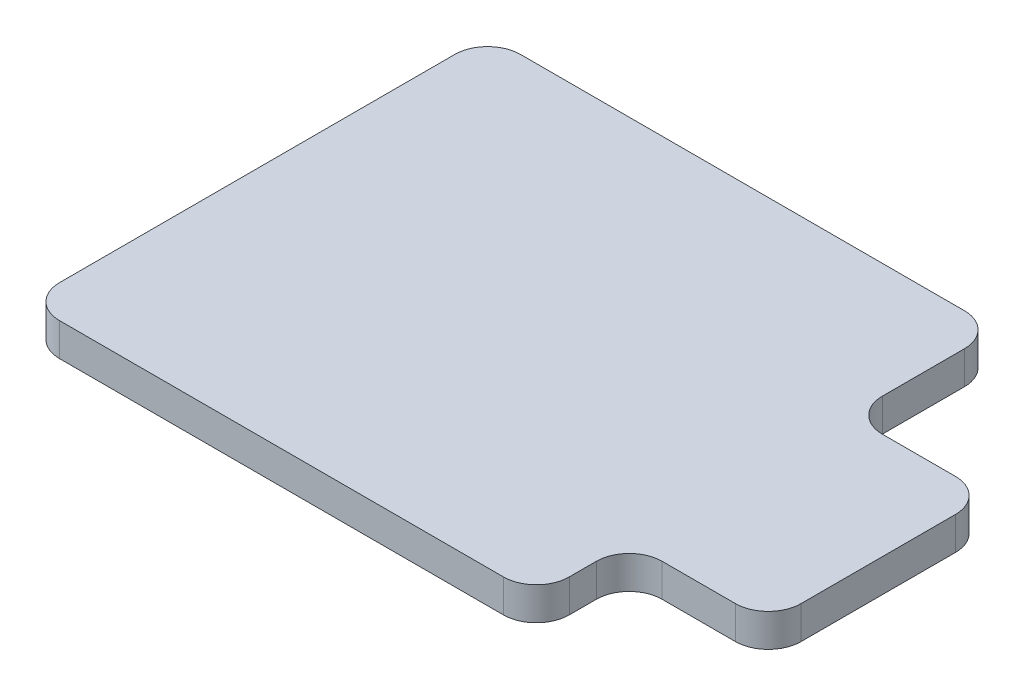
ISO-10303-21;
HEADER;
FILE_DESCRIPTION(('STEP AP214'),'2;1');
FILE_NAME('part.step','',(''),(''),'','','');
FILE_SCHEMA(('AUTOMOTIVE_DESIGN { 1 0 10303 214 1 1 1 1 }'));
ENDSEC;
DATA;
#1=APPLICATION_CONTEXT('core data for automotive mechanical design processes');
#2=APPLICATION_PROTOCOL_DEFINITION('international standard','automotive_design',2000,#1);
#3=PRODUCT_CONTEXT('',#1,'mechanical');
#4=PRODUCT('Part','Part','',(#3));
#5=PRODUCT_RELATED_PRODUCT_CATEGORY('part','',(#4));
#6=PRODUCT_DEFINITION_FORMATION('','',#4);
#7=PRODUCT_DEFINITION_CONTEXT('part definition',#1,'design');
#8=PRODUCT_DEFINITION('design','',#6,#7);
#9=PRODUCT_DEFINITION_SHAPE('','',#8);
#10=(LENGTH_UNIT() NAMED_UNIT(*) SI_UNIT(.MILLI.,.METRE.));
#11=(NAMED_UNIT(*) PLANE_ANGLE_UNIT() SI_UNIT($,.RADIAN.));
#12=(NAMED_UNIT(*) SI_UNIT($,.STERADIAN.) SOLID_ANGLE_UNIT());
#13=UNCERTAINTY_MEASURE_WITH_UNIT(LENGTH_MEASURE(1.E-05),#10,'distance_accuracy_value','');
#14=(GEOMETRIC_REPRESENTATION_CONTEXT(3) GLOBAL_UNCERTAINTY_ASSIGNED_CONTEXT((#13)) GLOBAL_UNIT_ASSIGNED_CONTEXT((#10,
#11,#12)) REPRESENTATION_CONTEXT('',''));
#15=CARTESIAN_POINT('',(0.,0.,0.));
#16=DIRECTION('',(0.,0.,1.));
#17=DIRECTION('',(1.,0.,0.));
#18=AXIS2_PLACEMENT_3D('',#15,#16,#17);
#19=CARTESIAN_POINT('',(0.,2.54,-6.36701226966257));
#20=DIRECTION('',(0.,0.,-1.));
#21=DIRECTION('',(-1.,0.,0.));
#22=AXIS2_PLACEMENT_3D('',#19,#20,#21);
#23=PLANE('',#22);
#24=DIRECTION('',(1.,0.,0.));
#25=VECTOR('',#24,1.);
#26=CARTESIAN_POINT('',(0.,0.,-6.36701226966257));
#27=LINE('',#26,#25);
#28=CARTESIAN_POINT('',(22.1981811644824,0.,-6.36701226966257));
#29=VERTEX_POINT('',#28);
#30=CARTESIAN_POINT('',(27.8398188355176,0.,-6.36701226966257));
#31=VERTEX_POINT('',#30);
#32=EDGE_CURVE('E183',#29,#31,#27,.T.);
#33=ORIENTED_EDGE('',*,*,#32,.F.);
#34=DIRECTION('',(0.,-1.,0.));
#35=VECTOR('',#34,1.);
#36=CARTESIAN_POINT('',(22.1981811644824,2.54,-6.36701226966257));
#37=LINE('',#36,#35);
#38=CARTESIAN_POINT('',(22.1981811644824,2.54,-6.36701226966257));
#39=VERTEX_POINT('',#38);
#40=EDGE_CURVE('E11',#39,#29,#37,.T.);
#41=ORIENTED_EDGE('',*,*,#40,.F.);
#42=DIRECTION('',(1.,0.,0.));
#43=VECTOR('',#42,1.);
#44=CARTESIAN_POINT('',(0.,2.54,-6.36701226966257));
#45=LINE('',#44,#43);
#46=CARTESIAN_POINT('',(27.8398188355176,2.54,-6.36701226966257));
#47=VERTEX_POINT('',#46);
#48=EDGE_CURVE('E221',#39,#47,#45,.T.);
#49=ORIENTED_EDGE('',*,*,#48,.T.);
#50=DIRECTION('',(0.,-1.,0.));
#51=VECTOR('',#50,1.);
#52=CARTESIAN_POINT('',(27.8398188355176,2.54,-6.36701226966257));
#53=LINE('',#52,#51);
#54=EDGE_CURVE('E57',#47,#31,#53,.T.);
#55=ORIENTED_EDGE('',*,*,#54,.T.);
#56=EDGE_LOOP('',(#33,#41,#49,#55));
#57=FACE_BOUND('',#56,.T.);
#58=ADVANCED_FACE('F41',(#57),#23,.T.);
#59=CARTESIAN_POINT('',(22.1981811644824,2.54,-8.90701226966257));
#60=DIRECTION('',(0.,-1.,0.));
#61=DIRECTION('',(0.,0.,-1.));
#62=AXIS2_PLACEMENT_3D('',#59,#60,#61);
#63=CYLINDRICAL_SURFACE('',#62,2.54);
#64=CARTESIAN_POINT('',(22.1981811644824,0.,-8.90701226966257));
#65=DIRECTION('',(0.,1.,0.));
#66=DIRECTION('',(0.,0.,1.));
#67=AXIS2_PLACEMENT_3D('',#64,#65,#66);
#68=CIRCLE('',#67,2.54);
#69=CARTESIAN_POINT('',(19.6581811644824,0.,-8.90701226966257));
#70=VERTEX_POINT('',#69);
#71=EDGE_CURVE('E185',#29,#70,#68,.F.);
#72=ORIENTED_EDGE('',*,*,#71,.T.);
#73=DIRECTION('',(0.,-1.,0.));
#74=VECTOR('',#73,1.);
#75=CARTESIAN_POINT('',(19.6581811644824,2.54,-8.90701226966257));
#76=LINE('',#75,#74);
#77=CARTESIAN_POINT('',(19.6581811644824,2.54,-8.90701226966257));
#78=VERTEX_POINT('',#77);
#79=EDGE_CURVE('E49',#78,#70,#76,.T.);
#80=ORIENTED_EDGE('',*,*,#79,.F.);
#81=CARTESIAN_POINT('',(22.1981811644824,2.54,-8.90701226966257));
#82=DIRECTION('',(0.,1.,0.));
#83=DIRECTION('',(0.,0.,1.));
#84=AXIS2_PLACEMENT_3D('',#81,#82,#83);
#85=CIRCLE('',#84,2.54);
#86=EDGE_CURVE('E273',#39,#78,#85,.F.);
#87=ORIENTED_EDGE('',*,*,#86,.F.);
#88=ORIENTED_EDGE('',*,*,#40,.T.);
#89=EDGE_LOOP('',(#72,#80,#87,#88));
#90=FACE_BOUND('',#89,.T.);
#91=ADVANCED_FACE('F313',(#90),#63,.F.);
#92=CARTESIAN_POINT('',(19.6581811644824,2.54,0.));
#93=DIRECTION('',(-1.,0.,0.));
#94=DIRECTION('',(0.,0.,1.));
#95=AXIS2_PLACEMENT_3D('',#92,#93,#94);
#96=PLANE('',#95);
#97=DIRECTION('',(0.,0.,-1.));
#98=VECTOR('',#97,1.);
#99=CARTESIAN_POINT('',(19.6581811644824,0.,0.));
#100=LINE('',#99,#98);
#101=CARTESIAN_POINT('',(19.6581811644824,0.,-15.24));
#102=VERTEX_POINT('',#101);
#103=EDGE_CURVE('E187',#70,#102,#100,.T.);
#104=ORIENTED_EDGE('',*,*,#103,.T.);
#105=DIRECTION('',(0.,-1.,0.));
#106=VECTOR('',#105,1.);
#107=CARTESIAN_POINT('',(19.6581811644824,2.54,-15.24));
#108=LINE('',#107,#106);
#109=CARTESIAN_POINT('',(19.6581811644824,2.54,-15.24));
#110=VERTEX_POINT('',#109);
#111=EDGE_CURVE('E247',#110,#102,#108,.T.);
#112=ORIENTED_EDGE('',*,*,#111,.F.);
#113=DIRECTION('',(0.,0.,-1.));
#114=VECTOR('',#113,1.);
#115=CARTESIAN_POINT('',(19.6581811644824,2.54,0.));
#116=LINE('',#115,#114);
#117=EDGE_CURVE('E255',#78,#110,#116,.T.);
#118=ORIENTED_EDGE('',*,*,#117,.F.);
#119=ORIENTED_EDGE('',*,*,#79,.T.);
#120=EDGE_LOOP('',(#104,#112,#118,#119));
#121=FACE_BOUND('',#120,.T.);
#122=ADVANCED_FACE('F253',(#121),#96,.F.);
#123=CARTESIAN_POINT('',(17.1181811644824,2.54,-15.24));
#124=DIRECTION('',(0.,-1.,0.));
#125=DIRECTION('',(0.,0.,-1.));
#126=AXIS2_PLACEMENT_3D('',#123,#124,#125);
#127=CYLINDRICAL_SURFACE('',#126,2.54);
#128=CARTESIAN_POINT('',(17.1181811644824,0.,-15.24));
#129=DIRECTION('',(0.,1.,0.));
#130=DIRECTION('',(0.,0.,1.));
#131=AXIS2_PLACEMENT_3D('',#128,#129,#130);
#132=CIRCLE('',#131,2.54);
#133=CARTESIAN_POINT('',(17.1181811644824,0.,-17.78));
#134=VERTEX_POINT('',#133);
#135=EDGE_CURVE('E190',#134,#102,#132,.F.);
#136=ORIENTED_EDGE('',*,*,#135,.F.);
#137=DIRECTION('',(0.,-1.,0.));
#138=VECTOR('',#137,1.);
#139=CARTESIAN_POINT('',(17.1181811644824,2.54,-17.78));
#140=LINE('',#139,#138);
#141=CARTESIAN_POINT('',(17.1181811644824,2.54,-17.78));
#142=VERTEX_POINT('',#141);
#143=EDGE_CURVE('E245',#142,#134,#140,.T.);
#144=ORIENTED_EDGE('',*,*,#143,.F.);
#145=CARTESIAN_POINT('',(17.1181811644824,2.54,-15.24));
#146=DIRECTION('',(0.,1.,0.));
#147=DIRECTION('',(0.,0.,1.));
#148=AXIS2_PLACEMENT_3D('',#145,#146,#147);
#149=CIRCLE('',#148,2.54);
#150=EDGE_CURVE('E266',#142,#110,#149,.F.);
#151=ORIENTED_EDGE('',*,*,#150,.T.);
#152=ORIENTED_EDGE('',*,*,#111,.T.);
#153=EDGE_LOOP('',(#136,#144,#151,#152));
#154=FACE_BOUND('',#153,.T.);
#155=ADVANCED_FACE('F263',(#154),#127,.T.);
#156=CARTESIAN_POINT('',(0.,2.54,-17.78));
#157=DIRECTION('',(0.,0.,-1.));
#158=DIRECTION('',(-1.,0.,0.));
#159=AXIS2_PLACEMENT_3D('',#156,#157,#158);
#160=PLANE('',#159);
#161=DIRECTION('',(1.,0.,0.));
#162=VECTOR('',#161,1.);
#163=CARTESIAN_POINT('',(0.,0.,-17.78));
#164=LINE('',#163,#162);
#165=CARTESIAN_POINT('',(-17.1181811644824,0.,-17.78));
#166=VERTEX_POINT('',#165);
#167=EDGE_CURVE('E193',#166,#134,#164,.T.);
#168=ORIENTED_EDGE('',*,*,#167,.F.);
#169=DIRECTION('',(0.,-1.,0.));
#170=VECTOR('',#169,1.);
#171=CARTESIAN_POINT('',(-17.1181811644824,2.54,-17.78));
#172=LINE('',#171,#170);
#173=CARTESIAN_POINT('',(-17.1181811644824,2.54,-17.78));
#174=VERTEX_POINT('',#173);
#175=EDGE_CURVE('E243',#174,#166,#172,.T.);
#176=ORIENTED_EDGE('',*,*,#175,.F.);
#177=DIRECTION('',(1.,0.,0.));
#178=VECTOR('',#177,1.);
#179=CARTESIAN_POINT('',(0.,2.54,-17.78));
#180=LINE('',#179,#178);
#181=EDGE_CURVE('E269',#174,#142,#180,.T.);
#182=ORIENTED_EDGE('',*,*,#181,.T.);
#183=ORIENTED_EDGE('',*,*,#143,.T.);
#184=EDGE_LOOP('',(#168,#176,#182,#183));
#185=FACE_BOUND('',#184,.T.);
#186=ADVANCED_FACE('F324',(#185),#160,.T.);
#187=CARTESIAN_POINT('',(-17.1181811644824,2.54,-15.24));
#188=DIRECTION('',(0.,-1.,0.));
#189=DIRECTION('',(0.,0.,-1.));
#190=AXIS2_PLACEMENT_3D('',#187,#188,#189);
#191=CYLINDRICAL_SURFACE('',#190,2.54);
#192=CARTESIAN_POINT('',(-17.1181811644824,0.,-15.24));
#193=DIRECTION('',(0.,1.,0.));
#194=DIRECTION('',(0.,0.,1.));
#195=AXIS2_PLACEMENT_3D('',#192,#193,#194);
#196=CIRCLE('',#195,2.54);
#197=CARTESIAN_POINT('',(-19.6581811644824,0.,-15.24));
#198=VERTEX_POINT('',#197);
#199=EDGE_CURVE('E196',#198,#166,#196,.F.);
#200=ORIENTED_EDGE('',*,*,#199,.F.);
#201=DIRECTION('',(0.,-1.,0.));
#202=VECTOR('',#201,1.);
#203=CARTESIAN_POINT('',(-19.6581811644824,2.54,-15.24));
#204=LINE('',#203,#202);
#205=CARTESIAN_POINT('',(-19.6581811644824,2.54,-15.24));
#206=VERTEX_POINT('',#205);
#207=EDGE_CURVE('E241',#206,#198,#204,.T.);
#208=ORIENTED_EDGE('',*,*,#207,.F.);
#209=CARTESIAN_POINT('',(-17.1181811644824,2.54,-15.24));
#210=DIRECTION('',(0.,1.,0.));
#211=DIRECTION('',(0.,0.,1.));
#212=AXIS2_PLACEMENT_3D('',#209,#210,#211);
#213=CIRCLE('',#212,2.54);
#214=EDGE_CURVE('E271',#206,#174,#213,.F.);
#215=ORIENTED_EDGE('',*,*,#214,.T.);
#216=ORIENTED_EDGE('',*,*,#175,.T.);
#217=EDGE_LOOP('',(#200,#208,#215,#216));
#218=FACE_BOUND('',#217,.T.);
#219=ADVANCED_FACE('F327',(#218),#191,.T.);
#220=CARTESIAN_POINT('',(-19.6581811644824,2.54,0.));
#221=DIRECTION('',(-1.,0.,0.));
#222=DIRECTION('',(0.,0.,1.));
#223=AXIS2_PLACEMENT_3D('',#220,#221,#222);
#224=PLANE('',#223);
#225=DIRECTION('',(0.,0.,-1.));
#226=VECTOR('',#225,1.);
#227=CARTESIAN_POINT('',(-19.6581811644824,0.,0.));
#228=LINE('',#227,#226);
#229=CARTESIAN_POINT('',(-19.6581811644824,0.,15.24));
#230=VERTEX_POINT('',#229);
#231=EDGE_CURVE('E199',#230,#198,#228,.T.);
#232=ORIENTED_EDGE('',*,*,#231,.F.);
#233=DIRECTION('',(0.,-1.,0.));
#234=VECTOR('',#233,1.);
#235=CARTESIAN_POINT('',(-19.6581811644824,2.54,15.24));
#236=LINE('',#235,#234);
#237=CARTESIAN_POINT('',(-19.6581811644824,2.54,15.24));
#238=VERTEX_POINT('',#237);
#239=EDGE_CURVE('E239',#238,#230,#236,.T.);
#240=ORIENTED_EDGE('',*,*,#239,.F.);
#241=DIRECTION('',(0.,0.,-1.));
#242=VECTOR('',#241,1.);
#243=CARTESIAN_POINT('',(-19.6581811644824,2.54,0.));
#244=LINE('',#243,#242);
#245=EDGE_CURVE('E279',#238,#206,#244,.T.);
#246=ORIENTED_EDGE('',*,*,#245,.T.);
#247=ORIENTED_EDGE('',*,*,#207,.T.);
#248=EDGE_LOOP('',(#232,#240,#246,#247));
#249=FACE_BOUND('',#248,.T.);
#250=ADVANCED_FACE('F331',(#249),#224,.T.);
#251=CARTESIAN_POINT('',(-17.1181811644824,2.54,15.24));
#252=DIRECTION('',(0.,-1.,0.));
#253=DIRECTION('',(0.,0.,-1.));
#254=AXIS2_PLACEMENT_3D('',#251,#252,#253);
#255=CYLINDRICAL_SURFACE('',#254,2.54);
#256=CARTESIAN_POINT('',(-17.1181811644824,0.,15.24));
#257=DIRECTION('',(0.,1.,0.));
#258=DIRECTION('',(0.,0.,1.));
#259=AXIS2_PLACEMENT_3D('',#256,#257,#258);
#260=CIRCLE('',#259,2.54);
#261=CARTESIAN_POINT('',(-17.1181811644824,0.,17.78));
#262=VERTEX_POINT('',#261);
#263=EDGE_CURVE('E202',#262,#230,#260,.F.);
#264=ORIENTED_EDGE('',*,*,#263,.F.);
#265=DIRECTION('',(0.,-1.,0.));
#266=VECTOR('',#265,1.);
#267=CARTESIAN_POINT('',(-17.1181811644824,2.54,17.78));
#268=LINE('',#267,#266);
#269=CARTESIAN_POINT('',(-17.1181811644824,2.54,17.78));
#270=VERTEX_POINT('',#269);
#271=EDGE_CURVE('E237',#270,#262,#268,.T.);
#272=ORIENTED_EDGE('',*,*,#271,.F.);
#273=CARTESIAN_POINT('',(-17.1181811644824,2.54,15.24));
#274=DIRECTION('',(0.,1.,0.));
#275=DIRECTION('',(0.,0.,1.));
#276=AXIS2_PLACEMENT_3D('',#273,#274,#275);
#277=CIRCLE('',#276,2.54);
#278=EDGE_CURVE('E282',#270,#238,#277,.F.);
#279=ORIENTED_EDGE('',*,*,#278,.T.);
#280=ORIENTED_EDGE('',*,*,#239,.T.);
#281=EDGE_LOOP('',(#264,#272,#279,#280));
#282=FACE_BOUND('',#281,.T.);
#283=ADVANCED_FACE('F335',(#282),#255,.T.);
#284=CARTESIAN_POINT('',(0.,2.54,17.78));
#285=DIRECTION('',(0.,0.,-1.));
#286=DIRECTION('',(-1.,0.,0.));
#287=AXIS2_PLACEMENT_3D('',#284,#285,#286);
#288=PLANE('',#287);
#289=DIRECTION('',(1.,0.,0.));
#290=VECTOR('',#289,1.);
#291=CARTESIAN_POINT('',(0.,0.,17.78));
#292=LINE('',#291,#290);
#293=CARTESIAN_POINT('',(17.1181811644824,0.,17.78));
#294=VERTEX_POINT('',#293);
#295=EDGE_CURVE('E205',#262,#294,#292,.T.);
#296=ORIENTED_EDGE('',*,*,#295,.T.);
#297=DIRECTION('',(0.,-1.,0.));
#298=VECTOR('',#297,1.);
#299=CARTESIAN_POINT('',(17.1181811644824,2.54,17.78));
#300=LINE('',#299,#298);
#301=CARTESIAN_POINT('',(17.1181811644824,2.54,17.78));
#302=VERTEX_POINT('',#301);
#303=EDGE_CURVE('E234',#302,#294,#300,.T.);
#304=ORIENTED_EDGE('',*,*,#303,.F.);
#305=DIRECTION('',(1.,0.,0.));
#306=VECTOR('',#305,1.);
#307=CARTESIAN_POINT('',(0.,2.54,17.78));
#308=LINE('',#307,#306);
#309=EDGE_CURVE('E285',#270,#302,#308,.T.);
#310=ORIENTED_EDGE('',*,*,#309,.F.);
#311=ORIENTED_EDGE('',*,*,#271,.T.);
#312=EDGE_LOOP('',(#296,#304,#310,#311));
#313=FACE_BOUND('',#312,.T.);
#314=ADVANCED_FACE('F339',(#313),#288,.F.);
#315=CARTESIAN_POINT('',(17.1181811644824,2.54,15.24));
#316=DIRECTION('',(0.,-1.,0.));
#317=DIRECTION('',(0.,0.,-1.));
#318=AXIS2_PLACEMENT_3D('',#315,#316,#317);
#319=CYLINDRICAL_SURFACE('',#318,2.54);
#320=CARTESIAN_POINT('',(17.1181811644824,0.,15.24));
#321=DIRECTION('',(0.,1.,0.));
#322=DIRECTION('',(0.,0.,1.));
#323=AXIS2_PLACEMENT_3D('',#320,#321,#322);
#324=CIRCLE('',#323,2.54);
#325=CARTESIAN_POINT('',(19.6581811644824,0.,15.24));
#326=VERTEX_POINT('',#325);
#327=EDGE_CURVE('E207',#294,#326,#324,.T.);
#328=ORIENTED_EDGE('',*,*,#327,.T.);
#329=DIRECTION('',(0.,-1.,0.));
#330=VECTOR('',#329,1.);
#331=CARTESIAN_POINT('',(19.6581811644824,2.54,15.24));
#332=LINE('',#331,#330);
#333=CARTESIAN_POINT('',(19.6581811644824,2.54,15.24));
#334=VERTEX_POINT('',#333);
#335=EDGE_CURVE('E231',#334,#326,#332,.T.);
#336=ORIENTED_EDGE('',*,*,#335,.F.);
#337=CARTESIAN_POINT('',(17.1181811644824,2.54,15.24));
#338=DIRECTION('',(0.,1.,0.));
#339=DIRECTION('',(0.,0.,1.));
#340=AXIS2_PLACEMENT_3D('',#337,#338,#339);
#341=CIRCLE('',#340,2.54);
#342=EDGE_CURVE('E287',#302,#334,#341,.T.);
#343=ORIENTED_EDGE('',*,*,#342,.F.);
#344=ORIENTED_EDGE('',*,*,#303,.T.);
#345=EDGE_LOOP('',(#328,#336,#343,#344));
#346=FACE_BOUND('',#345,.T.);
#347=ADVANCED_FACE('F343',(#346),#319,.T.);
#348=CARTESIAN_POINT('',(19.6581811644824,2.54,0.));
#349=DIRECTION('',(-1.,0.,0.));
#350=DIRECTION('',(0.,0.,1.));
#351=AXIS2_PLACEMENT_3D('',#348,#349,#350);
#352=PLANE('',#351);
#353=DIRECTION('',(0.,0.,-1.));
#354=VECTOR('',#353,1.);
#355=CARTESIAN_POINT('',(19.6581811644824,0.,0.));
#356=LINE('',#355,#354);
#357=CARTESIAN_POINT('',(19.6581811644824,0.,13.1558918479444));
#358=VERTEX_POINT('',#357);
#359=EDGE_CURVE('E209',#326,#358,#356,.T.);
#360=ORIENTED_EDGE('',*,*,#359,.T.);
#361=DIRECTION('',(0.,-1.,0.));
#362=VECTOR('',#361,1.);
#363=CARTESIAN_POINT('',(19.6581811644824,2.54,13.1558918479444));
#364=LINE('',#363,#362);
#365=CARTESIAN_POINT('',(19.6581811644824,2.54,13.1558918479444));
#366=VERTEX_POINT('',#365);
#367=EDGE_CURVE('E228',#366,#358,#364,.T.);
#368=ORIENTED_EDGE('',*,*,#367,.F.);
#369=DIRECTION('',(0.,0.,-1.));
#370=VECTOR('',#369,1.);
#371=CARTESIAN_POINT('',(19.6581811644824,2.54,0.));
#372=LINE('',#371,#370);
#373=EDGE_CURVE('E289',#334,#366,#372,.T.);
#374=ORIENTED_EDGE('',*,*,#373,.F.);
#375=ORIENTED_EDGE('',*,*,#335,.T.);
#376=EDGE_LOOP('',(#360,#368,#374,#375));
#377=FACE_BOUND('',#376,.T.);
#378=ADVANCED_FACE('F347',(#377),#352,.F.);
#379=CARTESIAN_POINT('',(22.1981811644824,2.54,13.1558918479444));
#380=DIRECTION('',(0.,-1.,0.));
#381=DIRECTION('',(0.,0.,-1.));
#382=AXIS2_PLACEMENT_3D('',#379,#380,#381);
#383=CYLINDRICAL_SURFACE('',#382,2.54);
#384=CARTESIAN_POINT('',(22.1981811644824,0.,13.1558918479444));
#385=DIRECTION('',(0.,1.,0.));
#386=DIRECTION('',(0.,0.,1.));
#387=AXIS2_PLACEMENT_3D('',#384,#385,#386);
#388=CIRCLE('',#387,2.54);
#389=CARTESIAN_POINT('',(22.1981811644824,0.,10.6158918479444));
#390=VERTEX_POINT('',#389);
#391=EDGE_CURVE('E211',#358,#390,#388,.F.);
#392=ORIENTED_EDGE('',*,*,#391,.T.);
#393=DIRECTION('',(0.,-1.,0.));
#394=VECTOR('',#393,1.);
#395=CARTESIAN_POINT('',(22.1981811644824,2.54,10.6158918479444));
#396=LINE('',#395,#394);
#397=CARTESIAN_POINT('',(22.1981811644824,2.54,10.6158918479444));
#398=VERTEX_POINT('',#397);
#399=EDGE_CURVE('E225',#398,#390,#396,.T.);
#400=ORIENTED_EDGE('',*,*,#399,.F.);
#401=CARTESIAN_POINT('',(22.1981811644824,2.54,13.1558918479444));
#402=DIRECTION('',(0.,1.,0.));
#403=DIRECTION('',(0.,0.,1.));
#404=AXIS2_PLACEMENT_3D('',#401,#402,#403);
#405=CIRCLE('',#404,2.54);
#406=EDGE_CURVE('E291',#366,#398,#405,.F.);
#407=ORIENTED_EDGE('',*,*,#406,.F.);
#408=ORIENTED_EDGE('',*,*,#367,.T.);
#409=EDGE_LOOP('',(#392,#400,#407,#408));
#410=FACE_BOUND('',#409,.T.);
#411=ADVANCED_FACE('F297',(#410),#383,.F.);
#412=CARTESIAN_POINT('',(0.,2.54,10.6158918479444));
#413=DIRECTION('',(0.,0.,-1.));
#414=DIRECTION('',(-1.,0.,0.));
#415=AXIS2_PLACEMENT_3D('',#412,#413,#414);
#416=PLANE('',#415);
#417=DIRECTION('',(1.,0.,0.));
#418=VECTOR('',#417,1.);
#419=CARTESIAN_POINT('',(0.,0.,10.6158918479444));
#420=LINE('',#419,#418);
#421=CARTESIAN_POINT('',(27.8398188355176,0.,10.6158918479444));
#422=VERTEX_POINT('',#421);
#423=EDGE_CURVE('E213',#390,#422,#420,.T.);
#424=ORIENTED_EDGE('',*,*,#423,.T.);
#425=DIRECTION('',(0.,-1.,0.));
#426=VECTOR('',#425,1.);
#427=CARTESIAN_POINT('',(27.8398188355176,2.54,10.6158918479444));
#428=LINE('',#427,#426);
#429=CARTESIAN_POINT('',(27.8398188355176,2.54,10.6158918479444));
#430=VERTEX_POINT('',#429);
#431=EDGE_CURVE('E175',#430,#422,#428,.T.);
#432=ORIENTED_EDGE('',*,*,#431,.F.);
#433=DIRECTION('',(1.,0.,0.));
#434=VECTOR('',#433,1.);
#435=CARTESIAN_POINT('',(0.,2.54,10.6158918479444));
#436=LINE('',#435,#434);
#437=EDGE_CURVE('E163',#398,#430,#436,.T.);
#438=ORIENTED_EDGE('',*,*,#437,.F.);
#439=ORIENTED_EDGE('',*,*,#399,.T.);
#440=EDGE_LOOP('',(#424,#432,#438,#439));
#441=FACE_BOUND('',#440,.T.);
#442=ADVANCED_FACE('F301',(#441),#416,.F.);
#443=CARTESIAN_POINT('',(27.8398188355176,2.54,8.07589184794443));
#444=DIRECTION('',(0.,-1.,0.));
#445=DIRECTION('',(0.,0.,-1.));
#446=AXIS2_PLACEMENT_3D('',#443,#444,#445);
#447=CYLINDRICAL_SURFACE('',#446,2.54);
#448=CARTESIAN_POINT('',(27.8398188355176,0.,8.07589184794443));
#449=DIRECTION('',(0.,1.,0.));
#450=DIRECTION('',(0.,0.,1.));
#451=AXIS2_PLACEMENT_3D('',#448,#449,#450);
#452=CIRCLE('',#451,2.54);
#453=CARTESIAN_POINT('',(30.3798188355176,0.,8.07589184794443));
#454=VERTEX_POINT('',#453);
#455=EDGE_CURVE('E172',#422,#454,#452,.T.);
#456=ORIENTED_EDGE('',*,*,#455,.T.);
#457=DIRECTION('',(0.,-1.,0.));
#458=VECTOR('',#457,1.);
#459=CARTESIAN_POINT('',(30.3798188355176,2.54,8.07589184794443));
#460=LINE('',#459,#458);
#461=CARTESIAN_POINT('',(30.3798188355176,2.54,8.07589184794443));
#462=VERTEX_POINT('',#461);
#463=EDGE_CURVE('E169',#462,#454,#460,.T.);
#464=ORIENTED_EDGE('',*,*,#463,.F.);
#465=CARTESIAN_POINT('',(27.8398188355176,2.54,8.07589184794443));
#466=DIRECTION('',(0.,1.,0.));
#467=DIRECTION('',(0.,0.,1.));
#468=AXIS2_PLACEMENT_3D('',#465,#466,#467);
#469=CIRCLE('',#468,2.54);
#470=EDGE_CURVE('E155',#430,#462,#469,.T.);
#471=ORIENTED_EDGE('',*,*,#470,.F.);
#472=ORIENTED_EDGE('',*,*,#431,.T.);
#473=EDGE_LOOP('',(#456,#464,#471,#472));
#474=FACE_BOUND('',#473,.T.);
#475=ADVANCED_FACE('F170',(#474),#447,.T.);
#476=CARTESIAN_POINT('',(30.3798188355176,2.54,0.));
#477=DIRECTION('',(1.,0.,0.));
#478=DIRECTION('',(0.,0.,-1.));
#479=AXIS2_PLACEMENT_3D('',#476,#477,#478);
#480=PLANE('',#479);
#481=DIRECTION('',(0.,0.,1.));
#482=VECTOR('',#481,1.);
#483=CARTESIAN_POINT('',(30.3798188355176,0.,0.));
#484=LINE('',#483,#482);
#485=CARTESIAN_POINT('',(30.3798188355176,0.,-3.82701226966257));
#486=VERTEX_POINT('',#485);
#487=EDGE_CURVE('E216',#486,#454,#484,.T.);
#488=ORIENTED_EDGE('',*,*,#487,.F.);
#489=DIRECTION('',(0.,-1.,0.));
#490=VECTOR('',#489,1.);
#491=CARTESIAN_POINT('',(30.3798188355176,2.54,-3.82701226966257));
#492=LINE('',#491,#490);
#493=CARTESIAN_POINT('',(30.3798188355176,2.54,-3.82701226966257));
#494=VERTEX_POINT('',#493);
#495=EDGE_CURVE('E106',#494,#486,#492,.T.);
#496=ORIENTED_EDGE('',*,*,#495,.F.);
#497=DIRECTION('',(0.,0.,1.));
#498=VECTOR('',#497,1.);
#499=CARTESIAN_POINT('',(30.3798188355176,2.54,0.));
#500=LINE('',#499,#498);
#501=EDGE_CURVE('E161',#494,#462,#500,.T.);
#502=ORIENTED_EDGE('',*,*,#501,.T.);
#503=ORIENTED_EDGE('',*,*,#463,.T.);
#504=EDGE_LOOP('',(#488,#496,#502,#503));
#505=FACE_BOUND('',#504,.T.);
#506=ADVANCED_FACE('F177',(#505),#480,.T.);
#507=CARTESIAN_POINT('',(27.8398188355176,2.54,-3.82701226966257));
#508=DIRECTION('',(0.,-1.,0.));
#509=DIRECTION('',(0.,0.,-1.));
#510=AXIS2_PLACEMENT_3D('',#507,#508,#509);
#511=CYLINDRICAL_SURFACE('',#510,2.54);
#512=CARTESIAN_POINT('',(27.8398188355176,0.,-3.82701226966257));
#513=DIRECTION('',(0.,1.,0.));
#514=DIRECTION('',(0.,0.,1.));
#515=AXIS2_PLACEMENT_3D('',#512,#513,#514);
#516=CIRCLE('',#515,2.54);
#517=EDGE_CURVE('E218',#31,#486,#516,.F.);
#518=ORIENTED_EDGE('',*,*,#517,.F.);
#519=ORIENTED_EDGE('',*,*,#54,.F.);
#520=CARTESIAN_POINT('',(27.8398188355176,2.54,-3.82701226966257));
#521=DIRECTION('',(0.,1.,0.));
#522=DIRECTION('',(0.,0.,1.));
#523=AXIS2_PLACEMENT_3D('',#520,#521,#522);
#524=CIRCLE('',#523,2.54);
#525=EDGE_CURVE('E178',#47,#494,#524,.F.);
#526=ORIENTED_EDGE('',*,*,#525,.T.);
#527=ORIENTED_EDGE('',*,*,#495,.T.);
#528=EDGE_LOOP('',(#518,#519,#526,#527));
#529=FACE_BOUND('',#528,.T.);
#530=ADVANCED_FACE('F302',(#529),#511,.T.);
#531=CARTESIAN_POINT('',(0.,2.54,0.));
#532=DIRECTION('',(0.,1.,0.));
#533=DIRECTION('',(0.,0.,1.));
#534=AXIS2_PLACEMENT_3D('',#531,#532,#533);
#535=PLANE('',#534);
#536=ORIENTED_EDGE('',*,*,#48,.F.);
#537=ORIENTED_EDGE('',*,*,#86,.T.);
#538=ORIENTED_EDGE('',*,*,#117,.T.);
#539=ORIENTED_EDGE('',*,*,#150,.F.);
#540=ORIENTED_EDGE('',*,*,#181,.F.);
#541=ORIENTED_EDGE('',*,*,#214,.F.);
#542=ORIENTED_EDGE('',*,*,#245,.F.);
#543=ORIENTED_EDGE('',*,*,#278,.F.);
#544=ORIENTED_EDGE('',*,*,#309,.T.);
#545=ORIENTED_EDGE('',*,*,#342,.T.);
#546=ORIENTED_EDGE('',*,*,#373,.T.);
#547=ORIENTED_EDGE('',*,*,#406,.T.);
#548=ORIENTED_EDGE('',*,*,#437,.T.);
#549=ORIENTED_EDGE('',*,*,#470,.T.);
#550=ORIENTED_EDGE('',*,*,#501,.F.);
#551=ORIENTED_EDGE('',*,*,#525,.F.);
#552=EDGE_LOOP('',(#536,#537,#538,#539,#540,#541,#542,#543,#544,#545,#546,#547,#548,#549,#550,#551));
#553=FACE_BOUND('',#552,.T.);
#554=ADVANCED_FACE('F158',(#553),#535,.T.);
#555=CARTESIAN_POINT('',(0.,0.,0.));
#556=DIRECTION('',(0.,1.,0.));
#557=DIRECTION('',(0.,0.,1.));
#558=AXIS2_PLACEMENT_3D('',#555,#556,#557);
#559=PLANE('',#558);
#560=ORIENTED_EDGE('',*,*,#32,.T.);
#561=ORIENTED_EDGE('',*,*,#517,.T.);
#562=ORIENTED_EDGE('',*,*,#487,.T.);
#563=ORIENTED_EDGE('',*,*,#455,.F.);
#564=ORIENTED_EDGE('',*,*,#423,.F.);
#565=ORIENTED_EDGE('',*,*,#391,.F.);
#566=ORIENTED_EDGE('',*,*,#359,.F.);
#567=ORIENTED_EDGE('',*,*,#327,.F.);
#568=ORIENTED_EDGE('',*,*,#295,.F.);
#569=ORIENTED_EDGE('',*,*,#263,.T.);
#570=ORIENTED_EDGE('',*,*,#231,.T.);
#571=ORIENTED_EDGE('',*,*,#199,.T.);
#572=ORIENTED_EDGE('',*,*,#167,.T.);
#573=ORIENTED_EDGE('',*,*,#135,.T.);
#574=ORIENTED_EDGE('',*,*,#103,.F.);
#575=ORIENTED_EDGE('',*,*,#71,.F.);
#576=EDGE_LOOP('',(#560,#561,#562,#563,#564,#565,#566,#567,#568,#569,#570,#571,#572,#573,#574,#575));
#577=FACE_BOUND('',#576,.T.);
#578=ADVANCED_FACE('F259',(#577),#559,.F.);
#579=CLOSED_SHELL('',(#58,#91,#122,#155,#186,#219,#250,#283,#314,#347,#378,#411,#442,#475,#506,
#530,#554,#578));
#580=MANIFOLD_SOLID_BREP('B2',#579);
#581=ADVANCED_BREP_SHAPE_REPRESENTATION('',(#18,#580),#14);
#582=SHAPE_DEFINITION_REPRESENTATION(#9,#581);
ENDSEC;
END-ISO-10303-21;
